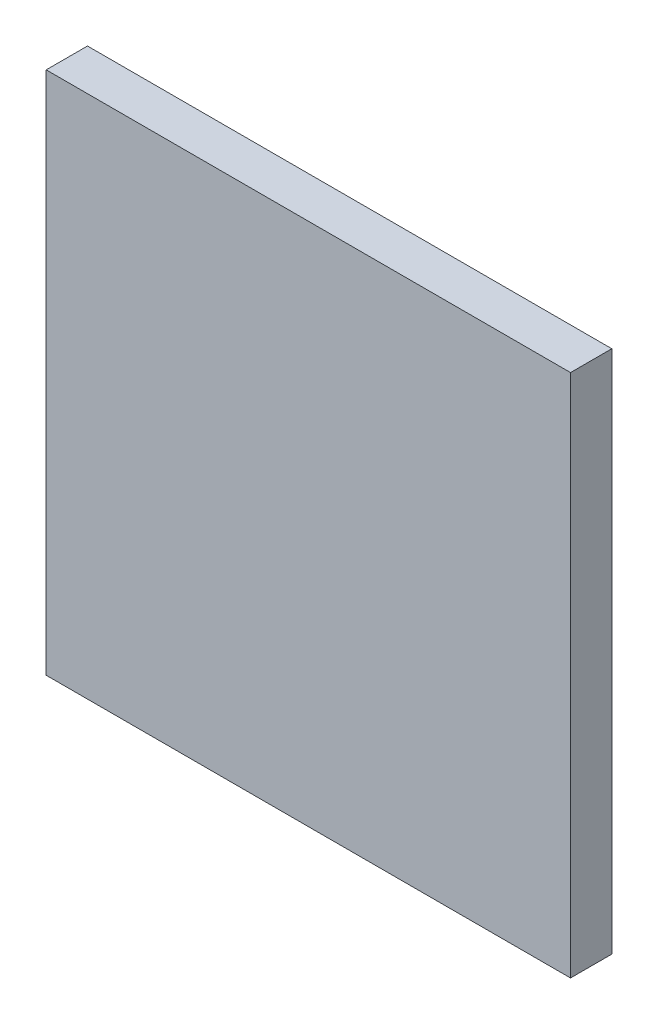
ISO-10303-21;
HEADER;
FILE_DESCRIPTION(('STEP AP214'),'2;1');
FILE_NAME('part.step','',(''),(''),'','','');
FILE_SCHEMA(('AUTOMOTIVE_DESIGN { 1 0 10303 214 1 1 1 1 }'));
ENDSEC;
DATA;
#1=APPLICATION_CONTEXT('core data for automotive mechanical design processes');
#2=APPLICATION_PROTOCOL_DEFINITION('international standard','automotive_design',2000,#1);
#3=PRODUCT_CONTEXT('',#1,'mechanical');
#4=PRODUCT('Part','Part','',(#3));
#5=PRODUCT_RELATED_PRODUCT_CATEGORY('part','',(#4));
#6=PRODUCT_DEFINITION_FORMATION('','',#4);
#7=PRODUCT_DEFINITION_CONTEXT('part definition',#1,'design');
#8=PRODUCT_DEFINITION('design','',#6,#7);
#9=PRODUCT_DEFINITION_SHAPE('','',#8);
#10=(LENGTH_UNIT() NAMED_UNIT(*) SI_UNIT(.MILLI.,.METRE.));
#11=(NAMED_UNIT(*) PLANE_ANGLE_UNIT() SI_UNIT($,.RADIAN.));
#12=(NAMED_UNIT(*) SI_UNIT($,.STERADIAN.) SOLID_ANGLE_UNIT());
#13=UNCERTAINTY_MEASURE_WITH_UNIT(LENGTH_MEASURE(1.E-05),#10,'distance_accuracy_value','');
#14=(GEOMETRIC_REPRESENTATION_CONTEXT(3) GLOBAL_UNCERTAINTY_ASSIGNED_CONTEXT((#13)) GLOBAL_UNIT_ASSIGNED_CONTEXT((#10,
#11,#12)) REPRESENTATION_CONTEXT('',''));
#15=CARTESIAN_POINT('',(0.,0.,0.));
#16=DIRECTION('',(0.,0.,1.));
#17=DIRECTION('',(1.,0.,0.));
#18=AXIS2_PLACEMENT_3D('',#15,#16,#17);
#19=CARTESIAN_POINT('',(0.,0.,4.));
#20=DIRECTION('',(-1.,0.,0.));
#21=DIRECTION('',(0.,-1.,0.));
#22=AXIS2_PLACEMENT_3D('',#19,#20,#21);
#23=PLANE('',#22);
#24=DIRECTION('',(0.,1.,0.));
#25=VECTOR('',#24,1.);
#26=CARTESIAN_POINT('',(0.,0.,0.));
#27=LINE('',#26,#25);
#28=CARTESIAN_POINT('',(0.,0.,0.));
#29=VERTEX_POINT('',#28);
#30=CARTESIAN_POINT('',(0.,50.8,0.));
#31=VERTEX_POINT('',#30);
#32=EDGE_CURVE('E100',#29,#31,#27,.T.);
#33=ORIENTED_EDGE('',*,*,#32,.T.);
#34=DIRECTION('',(0.,0.,-1.));
#35=VECTOR('',#34,1.);
#36=CARTESIAN_POINT('',(0.,50.8,4.));
#37=LINE('',#36,#35);
#38=CARTESIAN_POINT('',(0.,50.8,4.));
#39=VERTEX_POINT('',#38);
#40=EDGE_CURVE('E11',#39,#31,#37,.T.);
#41=ORIENTED_EDGE('',*,*,#40,.F.);
#42=DIRECTION('',(0.,1.,0.));
#43=VECTOR('',#42,1.);
#44=CARTESIAN_POINT('',(0.,0.,4.));
#45=LINE('',#44,#43);
#46=CARTESIAN_POINT('',(0.,0.,4.));
#47=VERTEX_POINT('',#46);
#48=EDGE_CURVE('E86',#47,#39,#45,.T.);
#49=ORIENTED_EDGE('',*,*,#48,.F.);
#50=DIRECTION('',(0.,0.,-1.));
#51=VECTOR('',#50,1.);
#52=CARTESIAN_POINT('',(0.,0.,4.));
#53=LINE('',#52,#51);
#54=EDGE_CURVE('E53',#47,#29,#53,.T.);
#55=ORIENTED_EDGE('',*,*,#54,.T.);
#56=EDGE_LOOP('',(#33,#41,#49,#55));
#57=FACE_BOUND('',#56,.T.);
#58=ADVANCED_FACE('F37',(#57),#23,.F.);
#59=CARTESIAN_POINT('',(0.,50.8,4.));
#60=DIRECTION('',(0.,-1.,0.));
#61=DIRECTION('',(1.,0.,0.));
#62=AXIS2_PLACEMENT_3D('',#59,#60,#61);
#63=PLANE('',#62);
#64=DIRECTION('',(-1.,0.,0.));
#65=VECTOR('',#64,1.);
#66=CARTESIAN_POINT('',(0.,50.8,0.));
#67=LINE('',#66,#65);
#68=CARTESIAN_POINT('',(-50.8,50.8,0.));
#69=VERTEX_POINT('',#68);
#70=EDGE_CURVE('E91',#31,#69,#67,.T.);
#71=ORIENTED_EDGE('',*,*,#70,.T.);
#72=DIRECTION('',(0.,0.,-1.));
#73=VECTOR('',#72,1.);
#74=CARTESIAN_POINT('',(-50.8,50.8,4.));
#75=LINE('',#74,#73);
#76=CARTESIAN_POINT('',(-50.8,50.8,4.));
#77=VERTEX_POINT('',#76);
#78=EDGE_CURVE('E45',#77,#69,#75,.T.);
#79=ORIENTED_EDGE('',*,*,#78,.F.);
#80=DIRECTION('',(-1.,0.,0.));
#81=VECTOR('',#80,1.);
#82=CARTESIAN_POINT('',(0.,50.8,4.));
#83=LINE('',#82,#81);
#84=EDGE_CURVE('E78',#39,#77,#83,.T.);
#85=ORIENTED_EDGE('',*,*,#84,.F.);
#86=ORIENTED_EDGE('',*,*,#40,.T.);
#87=EDGE_LOOP('',(#71,#79,#85,#86));
#88=FACE_BOUND('',#87,.T.);
#89=ADVANCED_FACE('F90',(#88),#63,.F.);
#90=CARTESIAN_POINT('',(-50.8,0.,4.));
#91=DIRECTION('',(-1.,0.,0.));
#92=DIRECTION('',(0.,0.,1.));
#93=AXIS2_PLACEMENT_3D('',#90,#91,#92);
#94=PLANE('',#93);
#95=DIRECTION('',(0.,1.,0.));
#96=VECTOR('',#95,1.);
#97=CARTESIAN_POINT('',(-50.8,0.,0.));
#98=LINE('',#97,#96);
#99=CARTESIAN_POINT('',(-50.8,0.,0.));
#100=VERTEX_POINT('',#99);
#101=EDGE_CURVE('E103',#100,#69,#98,.T.);
#102=ORIENTED_EDGE('',*,*,#101,.F.);
#103=DIRECTION('',(0.,0.,-1.));
#104=VECTOR('',#103,1.);
#105=CARTESIAN_POINT('',(-50.8,0.,4.));
#106=LINE('',#105,#104);
#107=CARTESIAN_POINT('',(-50.8,0.,4.));
#108=VERTEX_POINT('',#107);
#109=EDGE_CURVE('E67',#108,#100,#106,.T.);
#110=ORIENTED_EDGE('',*,*,#109,.F.);
#111=DIRECTION('',(0.,1.,0.));
#112=VECTOR('',#111,1.);
#113=CARTESIAN_POINT('',(-50.8,0.,4.));
#114=LINE('',#113,#112);
#115=EDGE_CURVE('E85',#108,#77,#114,.T.);
#116=ORIENTED_EDGE('',*,*,#115,.T.);
#117=ORIENTED_EDGE('',*,*,#78,.T.);
#118=EDGE_LOOP('',(#102,#110,#116,#117));
#119=FACE_BOUND('',#118,.T.);
#120=ADVANCED_FACE('F94',(#119),#94,.T.);
#121=CARTESIAN_POINT('',(0.,0.,4.));
#122=DIRECTION('',(0.,-1.,0.));
#123=DIRECTION('',(0.,0.,-1.));
#124=AXIS2_PLACEMENT_3D('',#121,#122,#123);
#125=PLANE('',#124);
#126=DIRECTION('',(-1.,0.,0.));
#127=VECTOR('',#126,1.);
#128=CARTESIAN_POINT('',(0.,0.,0.));
#129=LINE('',#128,#127);
#130=EDGE_CURVE('E105',#29,#100,#129,.T.);
#131=ORIENTED_EDGE('',*,*,#130,.F.);
#132=ORIENTED_EDGE('',*,*,#54,.F.);
#133=DIRECTION('',(-1.,0.,0.));
#134=VECTOR('',#133,1.);
#135=CARTESIAN_POINT('',(0.,0.,4.));
#136=LINE('',#135,#134);
#137=EDGE_CURVE('E95',#47,#108,#136,.T.);
#138=ORIENTED_EDGE('',*,*,#137,.T.);
#139=ORIENTED_EDGE('',*,*,#109,.T.);
#140=EDGE_LOOP('',(#131,#132,#138,#139));
#141=FACE_BOUND('',#140,.T.);
#142=ADVANCED_FACE('F111',(#141),#125,.T.);
#143=CARTESIAN_POINT('',(0.,0.,4.));
#144=DIRECTION('',(0.,0.,1.));
#145=DIRECTION('',(1.,0.,0.));
#146=AXIS2_PLACEMENT_3D('',#143,#144,#145);
#147=PLANE('',#146);
#148=ORIENTED_EDGE('',*,*,#48,.T.);
#149=ORIENTED_EDGE('',*,*,#84,.T.);
#150=ORIENTED_EDGE('',*,*,#115,.F.);
#151=ORIENTED_EDGE('',*,*,#137,.F.);
#152=EDGE_LOOP('',(#148,#149,#150,#151));
#153=FACE_BOUND('',#152,.T.);
#154=ADVANCED_FACE('F82',(#153),#147,.T.);
#155=CARTESIAN_POINT('',(0.,0.,0.));
#156=DIRECTION('',(0.,0.,1.));
#157=DIRECTION('',(1.,0.,0.));
#158=AXIS2_PLACEMENT_3D('',#155,#156,#157);
#159=PLANE('',#158);
#160=ORIENTED_EDGE('',*,*,#32,.F.);
#161=ORIENTED_EDGE('',*,*,#130,.T.);
#162=ORIENTED_EDGE('',*,*,#101,.T.);
#163=ORIENTED_EDGE('',*,*,#70,.F.);
#164=EDGE_LOOP('',(#160,#161,#162,#163));
#165=FACE_BOUND('',#164,.T.);
#166=ADVANCED_FACE('F110',(#165),#159,.F.);
#167=CLOSED_SHELL('',(#58,#89,#120,#142,#154,#166));
#168=MANIFOLD_SOLID_BREP('B2',#167);
#169=ADVANCED_BREP_SHAPE_REPRESENTATION('',(#18,#168),#14);
#170=SHAPE_DEFINITION_REPRESENTATION(#9,#169);
ENDSEC;
END-ISO-10303-21;
